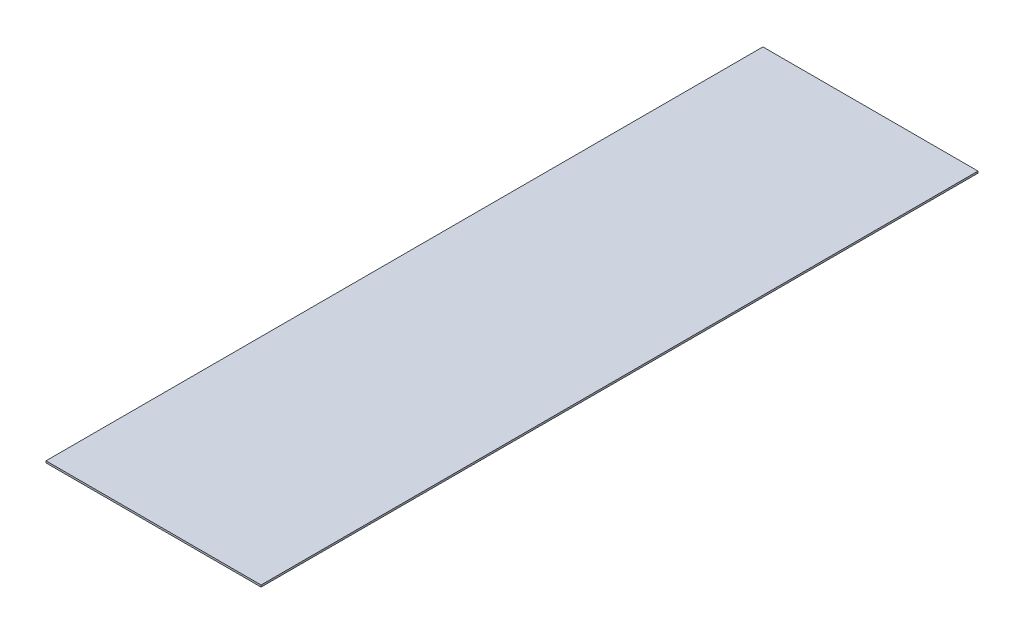
ISO-10303-21;
HEADER;
FILE_DESCRIPTION(('STEP AP214'),'2;1');
FILE_NAME('part.step','',(''),(''),'','','');
FILE_SCHEMA(('AUTOMOTIVE_DESIGN { 1 0 10303 214 1 1 1 1 }'));
ENDSEC;
DATA;
#1=APPLICATION_CONTEXT('core data for automotive mechanical design processes');
#2=APPLICATION_PROTOCOL_DEFINITION('international standard','automotive_design',2000,#1);
#3=PRODUCT_CONTEXT('',#1,'mechanical');
#4=PRODUCT('Part','Part','',(#3));
#5=PRODUCT_RELATED_PRODUCT_CATEGORY('part','',(#4));
#6=PRODUCT_DEFINITION_FORMATION('','',#4);
#7=PRODUCT_DEFINITION_CONTEXT('part definition',#1,'design');
#8=PRODUCT_DEFINITION('design','',#6,#7);
#9=PRODUCT_DEFINITION_SHAPE('','',#8);
#10=(LENGTH_UNIT() NAMED_UNIT(*) SI_UNIT(.MILLI.,.METRE.));
#11=(NAMED_UNIT(*) PLANE_ANGLE_UNIT() SI_UNIT($,.RADIAN.));
#12=(NAMED_UNIT(*) SI_UNIT($,.STERADIAN.) SOLID_ANGLE_UNIT());
#13=UNCERTAINTY_MEASURE_WITH_UNIT(LENGTH_MEASURE(1.E-05),#10,'distance_accuracy_value','');
#14=(GEOMETRIC_REPRESENTATION_CONTEXT(3) GLOBAL_UNCERTAINTY_ASSIGNED_CONTEXT((#13)) GLOBAL_UNIT_ASSIGNED_CONTEXT((#10,
#11,#12)) REPRESENTATION_CONTEXT('',''));
#15=CARTESIAN_POINT('',(0.,0.,0.));
#16=DIRECTION('',(0.,0.,1.));
#17=DIRECTION('',(1.,0.,0.));
#18=AXIS2_PLACEMENT_3D('',#15,#16,#17);
#19=CARTESIAN_POINT('',(457.2,7.9,1524.));
#20=DIRECTION('',(-1.,0.,0.));
#21=DIRECTION('',(0.,0.,1.));
#22=AXIS2_PLACEMENT_3D('',#19,#20,#21);
#23=PLANE('',#22);
#24=DIRECTION('',(0.,0.,-1.));
#25=VECTOR('',#24,1.);
#26=CARTESIAN_POINT('',(457.2,0.,1524.));
#27=LINE('',#26,#25);
#28=CARTESIAN_POINT('',(457.2,0.,1524.));
#29=VERTEX_POINT('',#28);
#30=CARTESIAN_POINT('',(457.2,0.,-1524.));
#31=VERTEX_POINT('',#30);
#32=EDGE_CURVE('E96',#29,#31,#27,.T.);
#33=ORIENTED_EDGE('',*,*,#32,.T.);
#34=DIRECTION('',(0.,-1.,0.));
#35=VECTOR('',#34,1.);
#36=CARTESIAN_POINT('',(457.2,7.9,-1524.));
#37=LINE('',#36,#35);
#38=CARTESIAN_POINT('',(457.2,7.9,-1524.));
#39=VERTEX_POINT('',#38);
#40=EDGE_CURVE('E11',#39,#31,#37,.T.);
#41=ORIENTED_EDGE('',*,*,#40,.F.);
#42=DIRECTION('',(0.,0.,-1.));
#43=VECTOR('',#42,1.);
#44=CARTESIAN_POINT('',(457.2,7.9,1524.));
#45=LINE('',#44,#43);
#46=CARTESIAN_POINT('',(457.2,7.9,1524.));
#47=VERTEX_POINT('',#46);
#48=EDGE_CURVE('E84',#47,#39,#45,.T.);
#49=ORIENTED_EDGE('',*,*,#48,.F.);
#50=DIRECTION('',(0.,-1.,0.));
#51=VECTOR('',#50,1.);
#52=CARTESIAN_POINT('',(457.2,7.9,1524.));
#53=LINE('',#52,#51);
#54=EDGE_CURVE('E92',#47,#29,#53,.T.);
#55=ORIENTED_EDGE('',*,*,#54,.T.);
#56=EDGE_LOOP('',(#33,#41,#49,#55));
#57=FACE_BOUND('',#56,.T.);
#58=ADVANCED_FACE('F33',(#57),#23,.F.);
#59=CARTESIAN_POINT('',(-457.2,7.9,-1524.));
#60=DIRECTION('',(0.,0.,1.));
#61=DIRECTION('',(1.,0.,0.));
#62=AXIS2_PLACEMENT_3D('',#59,#60,#61);
#63=PLANE('',#62);
#64=DIRECTION('',(-1.,0.,0.));
#65=VECTOR('',#64,1.);
#66=CARTESIAN_POINT('',(-457.2,0.,-1524.));
#67=LINE('',#66,#65);
#68=CARTESIAN_POINT('',(-457.2,0.,-1524.));
#69=VERTEX_POINT('',#68);
#70=EDGE_CURVE('E88',#31,#69,#67,.T.);
#71=ORIENTED_EDGE('',*,*,#70,.T.);
#72=DIRECTION('',(0.,-1.,0.));
#73=VECTOR('',#72,1.);
#74=CARTESIAN_POINT('',(-457.2,7.9,-1524.));
#75=LINE('',#74,#73);
#76=CARTESIAN_POINT('',(-457.2,7.9,-1524.));
#77=VERTEX_POINT('',#76);
#78=EDGE_CURVE('E41',#77,#69,#75,.T.);
#79=ORIENTED_EDGE('',*,*,#78,.F.);
#80=DIRECTION('',(-1.,0.,0.));
#81=VECTOR('',#80,1.);
#82=CARTESIAN_POINT('',(-457.2,7.9,-1524.));
#83=LINE('',#82,#81);
#84=EDGE_CURVE('E79',#39,#77,#83,.T.);
#85=ORIENTED_EDGE('',*,*,#84,.F.);
#86=ORIENTED_EDGE('',*,*,#40,.T.);
#87=EDGE_LOOP('',(#71,#79,#85,#86));
#88=FACE_BOUND('',#87,.T.);
#89=ADVANCED_FACE('F87',(#88),#63,.F.);
#90=CARTESIAN_POINT('',(-457.2,7.9,1524.));
#91=DIRECTION('',(1.,0.,0.));
#92=DIRECTION('',(0.,0.,-1.));
#93=AXIS2_PLACEMENT_3D('',#90,#91,#92);
#94=PLANE('',#93);
#95=DIRECTION('',(0.,0.,1.));
#96=VECTOR('',#95,1.);
#97=CARTESIAN_POINT('',(-457.2,0.,1524.));
#98=LINE('',#97,#96);
#99=CARTESIAN_POINT('',(-457.2,0.,1524.));
#100=VERTEX_POINT('',#99);
#101=EDGE_CURVE('E66',#69,#100,#98,.T.);
#102=ORIENTED_EDGE('',*,*,#101,.T.);
#103=DIRECTION('',(0.,-1.,0.));
#104=VECTOR('',#103,1.);
#105=CARTESIAN_POINT('',(-457.2,7.9,1524.));
#106=LINE('',#105,#104);
#107=CARTESIAN_POINT('',(-457.2,7.9,1524.));
#108=VERTEX_POINT('',#107);
#109=EDGE_CURVE('E89',#108,#100,#106,.T.);
#110=ORIENTED_EDGE('',*,*,#109,.F.);
#111=DIRECTION('',(0.,0.,1.));
#112=VECTOR('',#111,1.);
#113=CARTESIAN_POINT('',(-457.2,7.9,1524.));
#114=LINE('',#113,#112);
#115=EDGE_CURVE('E82',#77,#108,#114,.T.);
#116=ORIENTED_EDGE('',*,*,#115,.F.);
#117=ORIENTED_EDGE('',*,*,#78,.T.);
#118=EDGE_LOOP('',(#102,#110,#116,#117));
#119=FACE_BOUND('',#118,.T.);
#120=ADVANCED_FACE('F90',(#119),#94,.F.);
#121=CARTESIAN_POINT('',(-457.2,7.9,1524.));
#122=DIRECTION('',(0.,0.,-1.));
#123=DIRECTION('',(-1.,0.,0.));
#124=AXIS2_PLACEMENT_3D('',#121,#122,#123);
#125=PLANE('',#124);
#126=DIRECTION('',(1.,0.,0.));
#127=VECTOR('',#126,1.);
#128=CARTESIAN_POINT('',(-457.2,0.,1524.));
#129=LINE('',#128,#127);
#130=EDGE_CURVE('E72',#100,#29,#129,.T.);
#131=ORIENTED_EDGE('',*,*,#130,.T.);
#132=ORIENTED_EDGE('',*,*,#54,.F.);
#133=DIRECTION('',(1.,0.,0.));
#134=VECTOR('',#133,1.);
#135=CARTESIAN_POINT('',(-457.2,7.9,1524.));
#136=LINE('',#135,#134);
#137=EDGE_CURVE('E49',#108,#47,#136,.T.);
#138=ORIENTED_EDGE('',*,*,#137,.F.);
#139=ORIENTED_EDGE('',*,*,#109,.T.);
#140=EDGE_LOOP('',(#131,#132,#138,#139));
#141=FACE_BOUND('',#140,.T.);
#142=ADVANCED_FACE('F103',(#141),#125,.F.);
#143=CARTESIAN_POINT('',(0.,7.9,0.));
#144=DIRECTION('',(0.,-1.,0.));
#145=DIRECTION('',(0.,0.,-1.));
#146=AXIS2_PLACEMENT_3D('',#143,#144,#145);
#147=PLANE('',#146);
#148=ORIENTED_EDGE('',*,*,#48,.T.);
#149=ORIENTED_EDGE('',*,*,#84,.T.);
#150=ORIENTED_EDGE('',*,*,#115,.T.);
#151=ORIENTED_EDGE('',*,*,#137,.T.);
#152=EDGE_LOOP('',(#148,#149,#150,#151));
#153=FACE_BOUND('',#152,.T.);
#154=ADVANCED_FACE('F80',(#153),#147,.F.);
#155=CARTESIAN_POINT('',(0.,0.,0.));
#156=DIRECTION('',(0.,-1.,0.));
#157=DIRECTION('',(0.,0.,-1.));
#158=AXIS2_PLACEMENT_3D('',#155,#156,#157);
#159=PLANE('',#158);
#160=ORIENTED_EDGE('',*,*,#32,.F.);
#161=ORIENTED_EDGE('',*,*,#130,.F.);
#162=ORIENTED_EDGE('',*,*,#101,.F.);
#163=ORIENTED_EDGE('',*,*,#70,.F.);
#164=EDGE_LOOP('',(#160,#161,#162,#163));
#165=FACE_BOUND('',#164,.T.);
#166=ADVANCED_FACE('F106',(#165),#159,.T.);
#167=CLOSED_SHELL('',(#58,#89,#120,#142,#154,#166));
#168=MANIFOLD_SOLID_BREP('B2',#167);
#169=ADVANCED_BREP_SHAPE_REPRESENTATION('',(#18,#168),#14);
#170=SHAPE_DEFINITION_REPRESENTATION(#9,#169);
ENDSEC;
END-ISO-10303-21;
